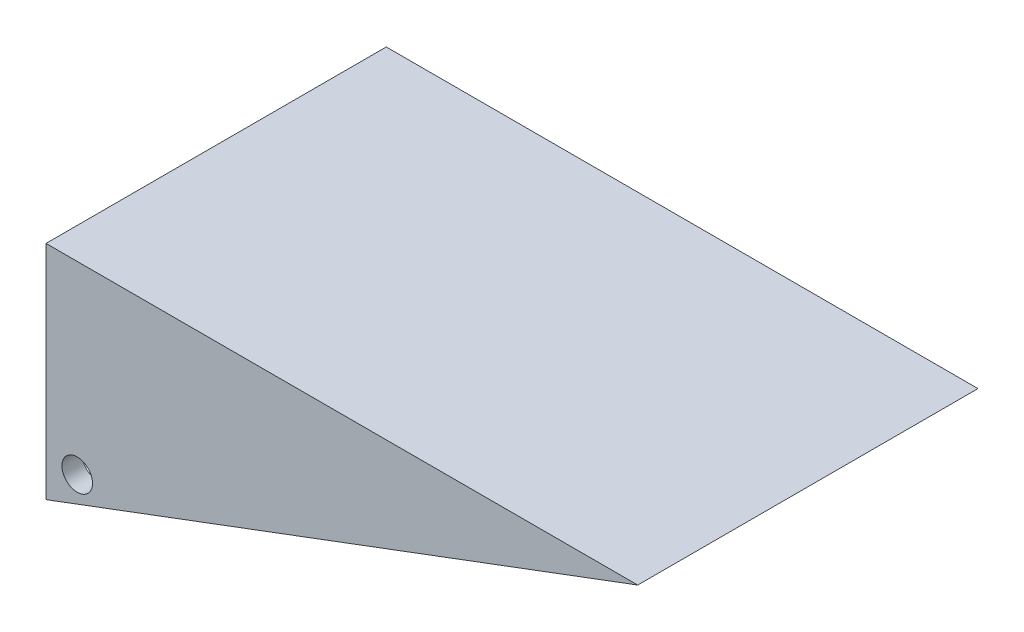
ISO-10303-21;
HEADER;
FILE_DESCRIPTION(('STEP AP214'),'2;1');
FILE_NAME('part.step','',(''),(''),'','','');
FILE_SCHEMA(('AUTOMOTIVE_DESIGN { 1 0 10303 214 1 1 1 1 }'));
ENDSEC;
DATA;
#1=APPLICATION_CONTEXT('core data for automotive mechanical design processes');
#2=APPLICATION_PROTOCOL_DEFINITION('international standard','automotive_design',2000,#1);
#3=PRODUCT_CONTEXT('',#1,'mechanical');
#4=PRODUCT('Part','Part','',(#3));
#5=PRODUCT_RELATED_PRODUCT_CATEGORY('part','',(#4));
#6=PRODUCT_DEFINITION_FORMATION('','',#4);
#7=PRODUCT_DEFINITION_CONTEXT('part definition',#1,'design');
#8=PRODUCT_DEFINITION('design','',#6,#7);
#9=PRODUCT_DEFINITION_SHAPE('','',#8);
#10=(LENGTH_UNIT() NAMED_UNIT(*) SI_UNIT(.MILLI.,.METRE.));
#11=(NAMED_UNIT(*) PLANE_ANGLE_UNIT() SI_UNIT($,.RADIAN.));
#12=(NAMED_UNIT(*) SI_UNIT($,.STERADIAN.) SOLID_ANGLE_UNIT());
#13=UNCERTAINTY_MEASURE_WITH_UNIT(LENGTH_MEASURE(1.E-05),#10,'distance_accuracy_value','');
#14=(GEOMETRIC_REPRESENTATION_CONTEXT(3) GLOBAL_UNCERTAINTY_ASSIGNED_CONTEXT((#13)) GLOBAL_UNIT_ASSIGNED_CONTEXT((#10,
#11,#12)) REPRESENTATION_CONTEXT('',''));
#15=CARTESIAN_POINT('',(0.,0.,0.));
#16=DIRECTION('',(0.,0.,1.));
#17=DIRECTION('',(1.,0.,0.));
#18=AXIS2_PLACEMENT_3D('',#15,#16,#17);
#19=CARTESIAN_POINT('',(0.,0.,-1.));
#20=DIRECTION('',(1.,0.,0.));
#21=DIRECTION('',(0.,0.,-1.));
#22=AXIS2_PLACEMENT_3D('',#19,#20,#21);
#23=PLANE('',#22);
#24=DIRECTION('',(0.,0.,1.));
#25=VECTOR('',#24,1.);
#26=CARTESIAN_POINT('',(0.,0.,-1.));
#27=LINE('',#26,#25);
#28=CARTESIAN_POINT('',(0.,0.,-1.));
#29=VERTEX_POINT('',#28);
#30=CARTESIAN_POINT('',(0.,0.,0.387607530548013));
#31=VERTEX_POINT('',#30);
#32=EDGE_CURVE('E135',#29,#31,#27,.T.);
#33=ORIENTED_EDGE('',*,*,#32,.T.);
#34=DIRECTION('',(0.,-1.,0.));
#35=VECTOR('',#34,1.);
#36=CARTESIAN_POINT('',(0.,13.5352146233128,0.387607530548013));
#37=LINE('',#36,#35);
#38=CARTESIAN_POINT('',(0.,13.5352146233128,0.387607530548013));
#39=VERTEX_POINT('',#38);
#40=EDGE_CURVE('E113',#39,#31,#37,.T.);
#41=ORIENTED_EDGE('',*,*,#40,.F.);
#42=DIRECTION('',(0.,0.,-1.));
#43=VECTOR('',#42,1.);
#44=CARTESIAN_POINT('',(0.,13.5352146233128,0.387607530548013));
#45=LINE('',#44,#43);
#46=CARTESIAN_POINT('',(0.,13.5352146233128,20.6371777451124));
#47=VERTEX_POINT('',#46);
#48=EDGE_CURVE('E101',#47,#39,#45,.T.);
#49=ORIENTED_EDGE('',*,*,#48,.F.);
#50=DIRECTION('',(0.,1.,0.));
#51=VECTOR('',#50,1.);
#52=CARTESIAN_POINT('',(0.,13.5352146233128,20.6371777451124));
#53=LINE('',#52,#51);
#54=CARTESIAN_POINT('',(0.,0.,20.6371777451124));
#55=VERTEX_POINT('',#54);
#56=EDGE_CURVE('E108',#55,#47,#53,.T.);
#57=ORIENTED_EDGE('',*,*,#56,.F.);
#58=CARTESIAN_POINT('',(0.,0.,22.));
#59=VERTEX_POINT('',#58);
#60=EDGE_CURVE('E134',#55,#59,#27,.T.);
#61=ORIENTED_EDGE('',*,*,#60,.T.);
#62=DIRECTION('',(0.,1.,0.));
#63=VECTOR('',#62,1.);
#64=CARTESIAN_POINT('',(0.,0.,22.));
#65=LINE('',#64,#63);
#66=CARTESIAN_POINT('',(0.,15.,22.));
#67=VERTEX_POINT('',#66);
#68=EDGE_CURVE('E119',#59,#67,#65,.T.);
#69=ORIENTED_EDGE('',*,*,#68,.T.);
#70=DIRECTION('',(0.,0.,1.));
#71=VECTOR('',#70,1.);
#72=CARTESIAN_POINT('',(0.,15.,-1.));
#73=LINE('',#72,#71);
#74=CARTESIAN_POINT('',(0.,15.,-1.));
#75=VERTEX_POINT('',#74);
#76=EDGE_CURVE('E139',#75,#67,#73,.T.);
#77=ORIENTED_EDGE('',*,*,#76,.F.);
#78=DIRECTION('',(0.,1.,0.));
#79=VECTOR('',#78,1.);
#80=CARTESIAN_POINT('',(0.,0.,-1.));
#81=LINE('',#80,#79);
#82=EDGE_CURVE('E129',#29,#75,#81,.T.);
#83=ORIENTED_EDGE('',*,*,#82,.F.);
#84=EDGE_LOOP('',(#33,#41,#49,#57,#61,#69,#77,#83));
#85=FACE_BOUND('',#84,.T.);
#86=ADVANCED_FACE('F45',(#85),#23,.F.);
#87=CARTESIAN_POINT('',(0.,15.,-1.));
#88=DIRECTION('',(0.,-1.,0.));
#89=DIRECTION('',(0.,0.,-1.));
#90=AXIS2_PLACEMENT_3D('',#87,#88,#89);
#91=PLANE('',#90);
#92=ORIENTED_EDGE('',*,*,#76,.T.);
#93=DIRECTION('',(1.,0.,0.));
#94=VECTOR('',#93,1.);
#95=CARTESIAN_POINT('',(0.,15.,22.));
#96=LINE('',#95,#94);
#97=CARTESIAN_POINT('',(40.,15.,22.));
#98=VERTEX_POINT('',#97);
#99=EDGE_CURVE('E123',#67,#98,#96,.T.);
#100=ORIENTED_EDGE('',*,*,#99,.T.);
#101=DIRECTION('',(0.,0.,1.));
#102=VECTOR('',#101,1.);
#103=CARTESIAN_POINT('',(40.,15.,-1.));
#104=LINE('',#103,#102);
#105=CARTESIAN_POINT('',(40.,15.,-1.));
#106=VERTEX_POINT('',#105);
#107=EDGE_CURVE('E137',#106,#98,#104,.T.);
#108=ORIENTED_EDGE('',*,*,#107,.F.);
#109=DIRECTION('',(1.,0.,0.));
#110=VECTOR('',#109,1.);
#111=CARTESIAN_POINT('',(0.,15.,-1.));
#112=LINE('',#111,#110);
#113=EDGE_CURVE('E131',#75,#106,#112,.T.);
#114=ORIENTED_EDGE('',*,*,#113,.F.);
#115=EDGE_LOOP('',(#92,#100,#108,#114));
#116=FACE_BOUND('',#115,.T.);
#117=ADVANCED_FACE('F152',(#116),#91,.F.);
#118=CARTESIAN_POINT('',(40.,15.,-1.));
#119=DIRECTION('',(-0.351123441588392,0.936329177569045,0.));
#120=DIRECTION('',(-0.936329177569045,-0.351123441588392,0.));
#121=AXIS2_PLACEMENT_3D('',#118,#119,#120);
#122=PLANE('',#121);
#123=DIRECTION('',(0.,0.,-1.));
#124=VECTOR('',#123,1.);
#125=CARTESIAN_POINT('',(36.0939056621674,13.5352146233128,-1.));
#126=LINE('',#125,#124);
#127=CARTESIAN_POINT('',(36.0939056621674,13.5352146233128,20.6371777451124));
#128=VERTEX_POINT('',#127);
#129=CARTESIAN_POINT('',(36.0939056621674,13.5352146233128,0.387607530548013));
#130=VERTEX_POINT('',#129);
#131=EDGE_CURVE('E53',#128,#130,#126,.T.);
#132=ORIENTED_EDGE('',*,*,#131,.T.);
#133=DIRECTION('',(-0.936329177569045,-0.351123441588392,0.));
#134=VECTOR('',#133,1.);
#135=CARTESIAN_POINT('',(40.,15.,0.387607530548013));
#136=LINE('',#135,#134);
#137=EDGE_CURVE('E11',#130,#31,#136,.T.);
#138=ORIENTED_EDGE('',*,*,#137,.T.);
#139=ORIENTED_EDGE('',*,*,#32,.F.);
#140=DIRECTION('',(-0.936329177569045,-0.351123441588392,0.));
#141=VECTOR('',#140,1.);
#142=CARTESIAN_POINT('',(40.,15.,-1.));
#143=LINE('',#142,#141);
#144=EDGE_CURVE('E68',#106,#29,#143,.T.);
#145=ORIENTED_EDGE('',*,*,#144,.F.);
#146=ORIENTED_EDGE('',*,*,#107,.T.);
#147=DIRECTION('',(-0.936329177569045,-0.351123441588392,0.));
#148=VECTOR('',#147,1.);
#149=CARTESIAN_POINT('',(40.,15.,22.));
#150=LINE('',#149,#148);
#151=EDGE_CURVE('E126',#98,#59,#150,.T.);
#152=ORIENTED_EDGE('',*,*,#151,.T.);
#153=ORIENTED_EDGE('',*,*,#60,.F.);
#154=DIRECTION('',(0.936329177569045,0.351123441588392,0.));
#155=VECTOR('',#154,1.);
#156=CARTESIAN_POINT('',(40.,15.,20.6371777451124));
#157=LINE('',#156,#155);
#158=EDGE_CURVE('E110',#55,#128,#157,.T.);
#159=ORIENTED_EDGE('',*,*,#158,.T.);
#160=EDGE_LOOP('',(#132,#138,#139,#145,#146,#152,#153,#159));
#161=FACE_BOUND('',#160,.T.);
#162=ADVANCED_FACE('F143',(#161),#122,.F.);
#163=CARTESIAN_POINT('',(0.,0.,-1.));
#164=DIRECTION('',(0.,0.,-1.));
#165=DIRECTION('',(-1.,0.,0.));
#166=AXIS2_PLACEMENT_3D('',#163,#164,#165);
#167=PLANE('',#166);
#168=CARTESIAN_POINT('',(2.11149669726099,2.52139245429801,-1.));
#169=DIRECTION('',(0.,0.,-1.));
#170=DIRECTION('',(-1.,0.,0.));
#171=AXIS2_PLACEMENT_3D('',#168,#169,#170);
#172=CIRCLE('',#171,1.03451585365237);
#173=CARTESIAN_POINT('',(1.07698084360862,2.52139245429801,-1.));
#174=VERTEX_POINT('',#173);
#175=EDGE_CURVE('E241',#174,#174,#172,.T.);
#176=ORIENTED_EDGE('',*,*,#175,.F.);
#177=EDGE_LOOP('',(#176));
#178=FACE_BOUND('',#177,.T.);
#179=ORIENTED_EDGE('',*,*,#82,.T.);
#180=ORIENTED_EDGE('',*,*,#113,.T.);
#181=ORIENTED_EDGE('',*,*,#144,.T.);
#182=EDGE_LOOP('',(#179,#180,#181));
#183=FACE_BOUND('',#182,.T.);
#184=ADVANCED_FACE('F154',(#178,#183),#167,.T.);
#185=CARTESIAN_POINT('',(0.,0.,22.));
#186=DIRECTION('',(0.,0.,-1.));
#187=DIRECTION('',(-1.,0.,0.));
#188=AXIS2_PLACEMENT_3D('',#185,#186,#187);
#189=PLANE('',#188);
#190=CARTESIAN_POINT('',(2.11149669726099,2.52139245429801,22.));
#191=DIRECTION('',(0.,0.,1.));
#192=DIRECTION('',(1.,0.,0.));
#193=AXIS2_PLACEMENT_3D('',#190,#191,#192);
#194=CIRCLE('',#193,1.03451585365237);
#195=CARTESIAN_POINT('',(3.14601255091336,2.52139245429801,22.));
#196=VERTEX_POINT('',#195);
#197=EDGE_CURVE('E248',#196,#196,#194,.T.);
#198=ORIENTED_EDGE('',*,*,#197,.F.);
#199=EDGE_LOOP('',(#198));
#200=FACE_BOUND('',#199,.T.);
#201=ORIENTED_EDGE('',*,*,#68,.F.);
#202=ORIENTED_EDGE('',*,*,#151,.F.);
#203=ORIENTED_EDGE('',*,*,#99,.F.);
#204=EDGE_LOOP('',(#201,#202,#203));
#205=FACE_BOUND('',#204,.T.);
#206=ADVANCED_FACE('F149',(#200,#205),#189,.F.);
#207=CARTESIAN_POINT('',(43.,13.5352146233128,0.387607530548013));
#208=DIRECTION('',(0.,0.,-1.));
#209=DIRECTION('',(-1.,0.,0.));
#210=AXIS2_PLACEMENT_3D('',#207,#208,#209);
#211=PLANE('',#210);
#212=CARTESIAN_POINT('',(2.11149669726099,2.52139245429801,0.387607530548013));
#213=DIRECTION('',(0.,0.,-1.));
#214=DIRECTION('',(-1.,0.,0.));
#215=AXIS2_PLACEMENT_3D('',#212,#213,#214);
#216=CIRCLE('',#215,1.03451585365237);
#217=CARTESIAN_POINT('',(1.07698084360862,2.52139245429801,0.387607530548013));
#218=VERTEX_POINT('',#217);
#219=EDGE_CURVE('E244',#218,#218,#216,.T.);
#220=ORIENTED_EDGE('',*,*,#219,.T.);
#221=EDGE_LOOP('',(#220));
#222=FACE_BOUND('',#221,.T.);
#223=DIRECTION('',(-1.,0.,0.));
#224=VECTOR('',#223,1.);
#225=CARTESIAN_POINT('',(43.,13.5352146233128,0.387607530548013));
#226=LINE('',#225,#224);
#227=EDGE_CURVE('E105',#130,#39,#226,.T.);
#228=ORIENTED_EDGE('',*,*,#227,.T.);
#229=ORIENTED_EDGE('',*,*,#40,.T.);
#230=ORIENTED_EDGE('',*,*,#137,.F.);
#231=EDGE_LOOP('',(#228,#229,#230));
#232=FACE_BOUND('',#231,.T.);
#233=ADVANCED_FACE('F162',(#222,#232),#211,.F.);
#234=CARTESIAN_POINT('',(43.,13.5352146233128,0.387607530548013));
#235=DIRECTION('',(0.,1.,0.));
#236=DIRECTION('',(0.,0.,1.));
#237=AXIS2_PLACEMENT_3D('',#234,#235,#236);
#238=PLANE('',#237);
#239=DIRECTION('',(-1.,0.,0.));
#240=VECTOR('',#239,1.);
#241=CARTESIAN_POINT('',(43.,13.5352146233128,20.6371777451124));
#242=LINE('',#241,#240);
#243=EDGE_CURVE('E60',#128,#47,#242,.T.);
#244=ORIENTED_EDGE('',*,*,#243,.T.);
#245=ORIENTED_EDGE('',*,*,#48,.T.);
#246=ORIENTED_EDGE('',*,*,#227,.F.);
#247=ORIENTED_EDGE('',*,*,#131,.F.);
#248=EDGE_LOOP('',(#244,#245,#246,#247));
#249=FACE_BOUND('',#248,.T.);
#250=ADVANCED_FACE('F98',(#249),#238,.F.);
#251=CARTESIAN_POINT('',(43.,13.5352146233128,20.6371777451124));
#252=DIRECTION('',(0.,0.,1.));
#253=DIRECTION('',(1.,0.,0.));
#254=AXIS2_PLACEMENT_3D('',#251,#252,#253);
#255=PLANE('',#254);
#256=CARTESIAN_POINT('',(2.11149669726099,2.52139245429801,20.6371777451124));
#257=DIRECTION('',(0.,0.,1.));
#258=DIRECTION('',(1.,0.,0.));
#259=AXIS2_PLACEMENT_3D('',#256,#257,#258);
#260=CIRCLE('',#259,1.03451585365237);
#261=CARTESIAN_POINT('',(3.14601255091336,2.52139245429801,20.6371777451124));
#262=VERTEX_POINT('',#261);
#263=EDGE_CURVE('E48',#262,#262,#260,.T.);
#264=ORIENTED_EDGE('',*,*,#263,.T.);
#265=EDGE_LOOP('',(#264));
#266=FACE_BOUND('',#265,.T.);
#267=ORIENTED_EDGE('',*,*,#56,.T.);
#268=ORIENTED_EDGE('',*,*,#243,.F.);
#269=ORIENTED_EDGE('',*,*,#158,.F.);
#270=EDGE_LOOP('',(#267,#268,#269));
#271=FACE_BOUND('',#270,.T.);
#272=ADVANCED_FACE('F109',(#266,#271),#255,.F.);
#273=CARTESIAN_POINT('',(2.11149669726099,2.52139245429801,-21.));
#274=DIRECTION('',(0.,0.,1.));
#275=DIRECTION('',(1.,0.,0.));
#276=AXIS2_PLACEMENT_3D('',#273,#274,#275);
#277=CYLINDRICAL_SURFACE('',#276,1.03451585365237);
#278=ORIENTED_EDGE('',*,*,#197,.T.);
#279=EDGE_LOOP('',(#278));
#280=FACE_BOUND('',#279,.T.);
#281=ORIENTED_EDGE('',*,*,#263,.F.);
#282=EDGE_LOOP('',(#281));
#283=FACE_BOUND('',#282,.T.);
#284=ADVANCED_FACE('F216',(#280,#283),#277,.F.);
#285=ORIENTED_EDGE('',*,*,#175,.T.);
#286=EDGE_LOOP('',(#285));
#287=FACE_BOUND('',#286,.T.);
#288=ORIENTED_EDGE('',*,*,#219,.F.);
#289=EDGE_LOOP('',(#288));
#290=FACE_BOUND('',#289,.T.);
#291=ADVANCED_FACE('F226',(#287,#290),#277,.F.);
#292=CLOSED_SHELL('',(#86,#117,#162,#184,#206,#233,#250,#272,#284,#291));
#293=MANIFOLD_SOLID_BREP('B2',#292);
#294=ADVANCED_BREP_SHAPE_REPRESENTATION('',(#18,#293),#14);
#295=SHAPE_DEFINITION_REPRESENTATION(#9,#294);
ENDSEC;
END-ISO-10303-21;
